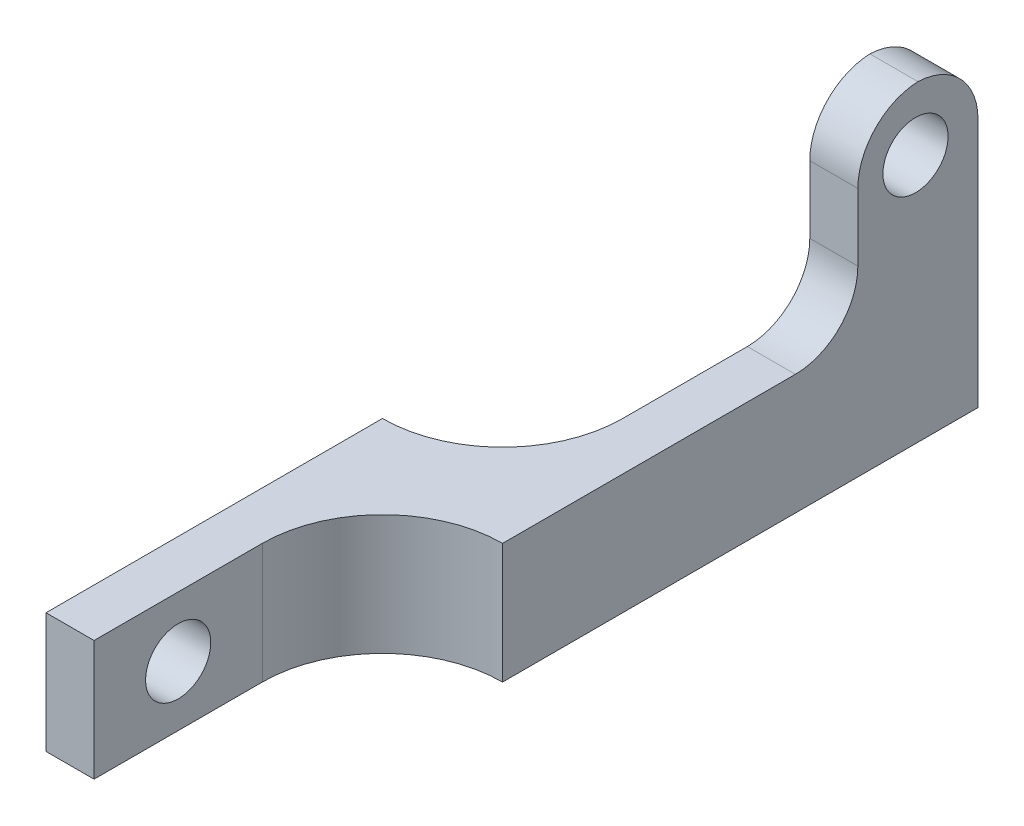
ISO-10303-21;
HEADER;
FILE_DESCRIPTION(('STEP AP214'),'2;1');
FILE_NAME('part.step','',(''),(''),'','','');
FILE_SCHEMA(('AUTOMOTIVE_DESIGN { 1 0 10303 214 1 1 1 1 }'));
ENDSEC;
DATA;
#1=APPLICATION_CONTEXT('core data for automotive mechanical design processes');
#2=APPLICATION_PROTOCOL_DEFINITION('international standard','automotive_design',2000,#1);
#3=PRODUCT_CONTEXT('',#1,'mechanical');
#4=PRODUCT('Part','Part','',(#3));
#5=PRODUCT_RELATED_PRODUCT_CATEGORY('part','',(#4));
#6=PRODUCT_DEFINITION_FORMATION('','',#4);
#7=PRODUCT_DEFINITION_CONTEXT('part definition',#1,'design');
#8=PRODUCT_DEFINITION('design','',#6,#7);
#9=PRODUCT_DEFINITION_SHAPE('','',#8);
#10=(LENGTH_UNIT() NAMED_UNIT(*) SI_UNIT(.MILLI.,.METRE.));
#11=(NAMED_UNIT(*) PLANE_ANGLE_UNIT() SI_UNIT($,.RADIAN.));
#12=(NAMED_UNIT(*) SI_UNIT($,.STERADIAN.) SOLID_ANGLE_UNIT());
#13=UNCERTAINTY_MEASURE_WITH_UNIT(LENGTH_MEASURE(1.E-05),#10,'distance_accuracy_value','');
#14=(GEOMETRIC_REPRESENTATION_CONTEXT(3) GLOBAL_UNCERTAINTY_ASSIGNED_CONTEXT((#13)) GLOBAL_UNIT_ASSIGNED_CONTEXT((#10,
#11,#12)) REPRESENTATION_CONTEXT('',''));
#15=CARTESIAN_POINT('',(0.,0.,0.));
#16=DIRECTION('',(0.,0.,1.));
#17=DIRECTION('',(1.,0.,0.));
#18=AXIS2_PLACEMENT_3D('',#15,#16,#17);
#19=CARTESIAN_POINT('',(0.,7.9375,0.));
#20=DIRECTION('',(1.,0.,0.));
#21=DIRECTION('',(0.,0.,-1.));
#22=AXIS2_PLACEMENT_3D('',#19,#20,#21);
#23=PLANE('',#22);
#24=CARTESIAN_POINT('',(0.,3.96875,-5.55625));
#25=DIRECTION('',(-1.,0.,0.));
#26=DIRECTION('',(0.,0.,1.));
#27=AXIS2_PLACEMENT_3D('',#24,#25,#26);
#28=CIRCLE('',#27,2.15264999999999);
#29=CARTESIAN_POINT('',(0.,3.96875,-3.40360000000001));
#30=VERTEX_POINT('',#29);
#31=EDGE_CURVE('E305',#30,#30,#28,.T.);
#32=ORIENTED_EDGE('',*,*,#31,.F.);
#33=EDGE_LOOP('',(#32));
#34=FACE_BOUND('',#33,.T.);
#35=DIRECTION('',(0.,0.,1.));
#36=VECTOR('',#35,1.);
#37=CARTESIAN_POINT('',(0.,0.,0.));
#38=LINE('',#37,#36);
#39=CARTESIAN_POINT('',(0.,0.,-22.225));
#40=VERTEX_POINT('',#39);
#41=CARTESIAN_POINT('',(0.,0.,0.));
#42=VERTEX_POINT('',#41);
#43=EDGE_CURVE('E192',#40,#42,#38,.T.);
#44=ORIENTED_EDGE('',*,*,#43,.T.);
#45=DIRECTION('',(0.,-1.,0.));
#46=VECTOR('',#45,1.);
#47=CARTESIAN_POINT('',(0.,7.9375,0.));
#48=LINE('',#47,#46);
#49=CARTESIAN_POINT('',(0.,7.9375,0.));
#50=VERTEX_POINT('',#49);
#51=EDGE_CURVE('E137',#50,#42,#48,.T.);
#52=ORIENTED_EDGE('',*,*,#51,.F.);
#53=DIRECTION('',(0.,0.,1.));
#54=VECTOR('',#53,1.);
#55=CARTESIAN_POINT('',(0.,7.9375,0.));
#56=LINE('',#55,#54);
#57=CARTESIAN_POINT('',(0.,7.9375,-22.225));
#58=VERTEX_POINT('',#57);
#59=EDGE_CURVE('E123',#58,#50,#56,.T.);
#60=ORIENTED_EDGE('',*,*,#59,.F.);
#61=DIRECTION('',(0.,-1.,0.));
#62=VECTOR('',#61,1.);
#63=CARTESIAN_POINT('',(0.,7.9375,-22.225));
#64=LINE('',#63,#62);
#65=EDGE_CURVE('E135',#58,#40,#64,.T.);
#66=ORIENTED_EDGE('',*,*,#65,.T.);
#67=EDGE_LOOP('',(#44,#52,#60,#66));
#68=FACE_BOUND('',#67,.T.);
#69=ADVANCED_FACE('F33',(#34,#68),#23,.F.);
#70=CARTESIAN_POINT('',(3.175,7.9375,0.));
#71=DIRECTION('',(0.,0.,-1.));
#72=DIRECTION('',(-1.,0.,0.));
#73=AXIS2_PLACEMENT_3D('',#70,#71,#72);
#74=PLANE('',#73);
#75=DIRECTION('',(1.,0.,0.));
#76=VECTOR('',#75,1.);
#77=CARTESIAN_POINT('',(3.175,0.,0.));
#78=LINE('',#77,#76);
#79=CARTESIAN_POINT('',(3.175,0.,0.));
#80=VERTEX_POINT('',#79);
#81=EDGE_CURVE('E207',#42,#80,#78,.T.);
#82=ORIENTED_EDGE('',*,*,#81,.T.);
#83=DIRECTION('',(0.,-1.,0.));
#84=VECTOR('',#83,1.);
#85=CARTESIAN_POINT('',(3.175,7.9375,0.));
#86=LINE('',#85,#84);
#87=CARTESIAN_POINT('',(3.175,7.9375,0.));
#88=VERTEX_POINT('',#87);
#89=EDGE_CURVE('E148',#88,#80,#86,.T.);
#90=ORIENTED_EDGE('',*,*,#89,.F.);
#91=DIRECTION('',(1.,0.,0.));
#92=VECTOR('',#91,1.);
#93=CARTESIAN_POINT('',(3.175,7.9375,0.));
#94=LINE('',#93,#92);
#95=EDGE_CURVE('E139',#50,#88,#94,.T.);
#96=ORIENTED_EDGE('',*,*,#95,.F.);
#97=ORIENTED_EDGE('',*,*,#51,.T.);
#98=EDGE_LOOP('',(#82,#90,#96,#97));
#99=FACE_BOUND('',#98,.T.);
#100=ADVANCED_FACE('F247',(#99),#74,.F.);
#101=CARTESIAN_POINT('',(3.175,7.9375,-19.05));
#102=DIRECTION('',(-1.,0.,0.));
#103=DIRECTION('',(0.,0.,1.));
#104=AXIS2_PLACEMENT_3D('',#101,#102,#103);
#105=PLANE('',#104);
#106=CARTESIAN_POINT('',(3.175,3.96875,-5.55625));
#107=DIRECTION('',(-1.,0.,0.));
#108=DIRECTION('',(0.,0.,1.));
#109=AXIS2_PLACEMENT_3D('',#106,#107,#108);
#110=CIRCLE('',#109,2.15264999999999);
#111=CARTESIAN_POINT('',(3.175,3.96875,-3.40360000000001));
#112=VERTEX_POINT('',#111);
#113=EDGE_CURVE('E308',#112,#112,#110,.T.);
#114=ORIENTED_EDGE('',*,*,#113,.T.);
#115=EDGE_LOOP('',(#114));
#116=FACE_BOUND('',#115,.T.);
#117=DIRECTION('',(0.,0.,-1.));
#118=VECTOR('',#117,1.);
#119=CARTESIAN_POINT('',(3.175,0.,-19.05));
#120=LINE('',#119,#118);
#121=CARTESIAN_POINT('',(3.175,0.,-11.1125));
#122=VERTEX_POINT('',#121);
#123=EDGE_CURVE('E209',#80,#122,#120,.T.);
#124=ORIENTED_EDGE('',*,*,#123,.T.);
#125=DIRECTION('',(0.,-1.,0.));
#126=VECTOR('',#125,1.);
#127=CARTESIAN_POINT('',(3.175,7.9375,-11.1125));
#128=LINE('',#127,#126);
#129=CARTESIAN_POINT('',(3.175,7.9375,-11.1125));
#130=VERTEX_POINT('',#129);
#131=EDGE_CURVE('E146',#122,#130,#128,.F.);
#132=ORIENTED_EDGE('',*,*,#131,.T.);
#133=DIRECTION('',(0.,0.,-1.));
#134=VECTOR('',#133,1.);
#135=CARTESIAN_POINT('',(3.175,7.9375,-19.05));
#136=LINE('',#135,#134);
#137=EDGE_CURVE('E199',#88,#130,#136,.T.);
#138=ORIENTED_EDGE('',*,*,#137,.F.);
#139=ORIENTED_EDGE('',*,*,#89,.T.);
#140=EDGE_LOOP('',(#124,#132,#138,#139));
#141=FACE_BOUND('',#140,.T.);
#142=ADVANCED_FACE('F230',(#116,#141),#105,.F.);
#143=CARTESIAN_POINT('',(11.1125,7.9375,-50.45837));
#144=DIRECTION('',(-1.,0.,0.));
#145=DIRECTION('',(0.,0.,1.));
#146=AXIS2_PLACEMENT_3D('',#143,#144,#145);
#147=PLANE('',#146);
#148=CARTESIAN_POINT('',(11.1125,16.51,-46.33087));
#149=DIRECTION('',(-1.,0.,0.));
#150=DIRECTION('',(0.,0.,1.));
#151=AXIS2_PLACEMENT_3D('',#148,#149,#150);
#152=CIRCLE('',#151,2.15265);
#153=CARTESIAN_POINT('',(11.1125,16.51,-44.17822));
#154=VERTEX_POINT('',#153);
#155=EDGE_CURVE('E195',#154,#154,#152,.T.);
#156=ORIENTED_EDGE('',*,*,#155,.T.);
#157=EDGE_LOOP('',(#156));
#158=FACE_BOUND('',#157,.T.);
#159=DIRECTION('',(0.,-1.,0.));
#160=VECTOR('',#159,1.);
#161=CARTESIAN_POINT('',(11.1125,7.9375,-50.45837));
#162=LINE('',#161,#160);
#163=CARTESIAN_POINT('',(11.1125,16.51,-50.45837));
#164=VERTEX_POINT('',#163);
#165=CARTESIAN_POINT('',(11.1125,0.,-50.45837));
#166=VERTEX_POINT('',#165);
#167=EDGE_CURVE('E221',#164,#166,#162,.T.);
#168=ORIENTED_EDGE('',*,*,#167,.F.);
#169=CARTESIAN_POINT('',(11.1125,16.51,-46.33087));
#170=DIRECTION('',(-1.,0.,0.));
#171=DIRECTION('',(0.,0.,1.));
#172=AXIS2_PLACEMENT_3D('',#169,#170,#171);
#173=CIRCLE('',#172,4.1275);
#174=CARTESIAN_POINT('',(11.1125,20.6344459855234,-46.48962));
#175=VERTEX_POINT('',#174);
#176=EDGE_CURVE('E166',#164,#175,#173,.F.);
#177=ORIENTED_EDGE('',*,*,#176,.T.);
#178=CARTESIAN_POINT('',(11.1125,16.51,-46.64837));
#179=DIRECTION('',(-1.,0.,0.));
#180=DIRECTION('',(0.,0.,1.));
#181=AXIS2_PLACEMENT_3D('',#178,#179,#180);
#182=CIRCLE('',#181,4.1275);
#183=CARTESIAN_POINT('',(11.1125,16.51,-42.52087));
#184=VERTEX_POINT('',#183);
#185=EDGE_CURVE('E164',#175,#184,#182,.F.);
#186=ORIENTED_EDGE('',*,*,#185,.T.);
#187=DIRECTION('',(0.,-1.,0.));
#188=VECTOR('',#187,1.);
#189=CARTESIAN_POINT('',(11.1125,20.6375,-42.52087));
#190=LINE('',#189,#188);
#191=CARTESIAN_POINT('',(11.1125,12.065,-42.52087));
#192=VERTEX_POINT('',#191);
#193=EDGE_CURVE('E174',#184,#192,#190,.T.);
#194=ORIENTED_EDGE('',*,*,#193,.T.);
#195=CARTESIAN_POINT('',(11.1125,12.065,-38.39337));
#196=DIRECTION('',(-1.,0.,0.));
#197=DIRECTION('',(0.,0.,1.));
#198=AXIS2_PLACEMENT_3D('',#195,#196,#197);
#199=CIRCLE('',#198,4.1275);
#200=CARTESIAN_POINT('',(11.1125,7.9375,-38.39337));
#201=VERTEX_POINT('',#200);
#202=EDGE_CURVE('E42',#192,#201,#199,.T.);
#203=ORIENTED_EDGE('',*,*,#202,.T.);
#204=DIRECTION('',(0.,0.,-1.));
#205=VECTOR('',#204,1.);
#206=CARTESIAN_POINT('',(11.1125,7.9375,-50.45837));
#207=LINE('',#206,#205);
#208=CARTESIAN_POINT('',(11.1125,7.9375,-19.05));
#209=VERTEX_POINT('',#208);
#210=EDGE_CURVE('E202',#209,#201,#207,.T.);
#211=ORIENTED_EDGE('',*,*,#210,.F.);
#212=DIRECTION('',(0.,-1.,0.));
#213=VECTOR('',#212,1.);
#214=CARTESIAN_POINT('',(11.1125,7.9375,-19.05));
#215=LINE('',#214,#213);
#216=CARTESIAN_POINT('',(11.1125,0.,-19.05));
#217=VERTEX_POINT('',#216);
#218=EDGE_CURVE('E223',#209,#217,#215,.T.);
#219=ORIENTED_EDGE('',*,*,#218,.T.);
#220=DIRECTION('',(0.,0.,-1.));
#221=VECTOR('',#220,1.);
#222=CARTESIAN_POINT('',(11.1125,0.,-50.45837));
#223=LINE('',#222,#221);
#224=EDGE_CURVE('E212',#217,#166,#223,.T.);
#225=ORIENTED_EDGE('',*,*,#224,.T.);
#226=EDGE_LOOP('',(#168,#177,#186,#194,#203,#211,#219,#225));
#227=FACE_BOUND('',#226,.T.);
#228=ADVANCED_FACE('F189',(#158,#227),#147,.F.);
#229=CARTESIAN_POINT('',(7.9375,7.9375,-50.45837));
#230=DIRECTION('',(0.,0.,1.));
#231=DIRECTION('',(1.,0.,0.));
#232=AXIS2_PLACEMENT_3D('',#229,#230,#231);
#233=PLANE('',#232);
#234=DIRECTION('',(0.,-1.,0.));
#235=VECTOR('',#234,1.);
#236=CARTESIAN_POINT('',(7.9375,7.9375,-50.45837));
#237=LINE('',#236,#235);
#238=CARTESIAN_POINT('',(7.9375,16.51,-50.45837));
#239=VERTEX_POINT('',#238);
#240=CARTESIAN_POINT('',(7.9375,0.,-50.45837));
#241=VERTEX_POINT('',#240);
#242=EDGE_CURVE('E205',#239,#241,#237,.T.);
#243=ORIENTED_EDGE('',*,*,#242,.F.);
#244=DIRECTION('',(-1.,0.,0.));
#245=VECTOR('',#244,1.);
#246=CARTESIAN_POINT('',(7.9375,16.51,-50.45837));
#247=LINE('',#246,#245);
#248=EDGE_CURVE('E161',#239,#164,#247,.F.);
#249=ORIENTED_EDGE('',*,*,#248,.T.);
#250=ORIENTED_EDGE('',*,*,#167,.T.);
#251=DIRECTION('',(-1.,0.,0.));
#252=VECTOR('',#251,1.);
#253=CARTESIAN_POINT('',(7.9375,0.,-50.45837));
#254=LINE('',#253,#252);
#255=EDGE_CURVE('E215',#166,#241,#254,.T.);
#256=ORIENTED_EDGE('',*,*,#255,.T.);
#257=EDGE_LOOP('',(#243,#249,#250,#256));
#258=FACE_BOUND('',#257,.T.);
#259=ADVANCED_FACE('F278',(#258),#233,.F.);
#260=CARTESIAN_POINT('',(7.9375,7.9375,-22.225));
#261=DIRECTION('',(1.,0.,0.));
#262=DIRECTION('',(0.,0.,-1.));
#263=AXIS2_PLACEMENT_3D('',#260,#261,#262);
#264=PLANE('',#263);
#265=CARTESIAN_POINT('',(7.9375,16.51,-46.33087));
#266=DIRECTION('',(1.,0.,0.));
#267=DIRECTION('',(0.,0.,-1.));
#268=AXIS2_PLACEMENT_3D('',#265,#266,#267);
#269=CIRCLE('',#268,2.15264999999999);
#270=CARTESIAN_POINT('',(7.9375,16.51,-48.48352));
#271=VERTEX_POINT('',#270);
#272=EDGE_CURVE('E37',#271,#271,#269,.T.);
#273=ORIENTED_EDGE('',*,*,#272,.T.);
#274=EDGE_LOOP('',(#273));
#275=FACE_BOUND('',#274,.T.);
#276=CARTESIAN_POINT('',(7.9375,16.51,-46.64837));
#277=DIRECTION('',(1.,0.,0.));
#278=DIRECTION('',(0.,0.,-1.));
#279=AXIS2_PLACEMENT_3D('',#276,#277,#278);
#280=CIRCLE('',#279,4.1275);
#281=CARTESIAN_POINT('',(7.9375,16.51,-42.52087));
#282=VERTEX_POINT('',#281);
#283=CARTESIAN_POINT('',(7.9375,20.6344459855234,-46.48962));
#284=VERTEX_POINT('',#283);
#285=EDGE_CURVE('E157',#282,#284,#280,.F.);
#286=ORIENTED_EDGE('',*,*,#285,.T.);
#287=CARTESIAN_POINT('',(7.9375,16.51,-46.33087));
#288=DIRECTION('',(1.,0.,0.));
#289=DIRECTION('',(0.,0.,-1.));
#290=AXIS2_PLACEMENT_3D('',#287,#288,#289);
#291=CIRCLE('',#290,4.1275);
#292=EDGE_CURVE('E159',#284,#239,#291,.F.);
#293=ORIENTED_EDGE('',*,*,#292,.T.);
#294=ORIENTED_EDGE('',*,*,#242,.T.);
#295=DIRECTION('',(0.,0.,1.));
#296=VECTOR('',#295,1.);
#297=CARTESIAN_POINT('',(7.9375,0.,-22.225));
#298=LINE('',#297,#296);
#299=CARTESIAN_POINT('',(7.9375,0.,-30.1625));
#300=VERTEX_POINT('',#299);
#301=EDGE_CURVE('E140',#241,#300,#298,.T.);
#302=ORIENTED_EDGE('',*,*,#301,.T.);
#303=DIRECTION('',(0.,-1.,0.));
#304=VECTOR('',#303,1.);
#305=CARTESIAN_POINT('',(7.9375,7.9375,-30.1625));
#306=LINE('',#305,#304);
#307=CARTESIAN_POINT('',(7.9375,7.9375,-30.1625));
#308=VERTEX_POINT('',#307);
#309=EDGE_CURVE('E144',#300,#308,#306,.F.);
#310=ORIENTED_EDGE('',*,*,#309,.T.);
#311=DIRECTION('',(0.,0.,1.));
#312=VECTOR('',#311,1.);
#313=CARTESIAN_POINT('',(7.9375,7.9375,-22.225));
#314=LINE('',#313,#312);
#315=CARTESIAN_POINT('',(7.9375,7.9375,-38.39337));
#316=VERTEX_POINT('',#315);
#317=EDGE_CURVE('E125',#316,#308,#314,.T.);
#318=ORIENTED_EDGE('',*,*,#317,.F.);
#319=CARTESIAN_POINT('',(7.9375,12.065,-38.39337));
#320=DIRECTION('',(1.,0.,0.));
#321=DIRECTION('',(0.,0.,-1.));
#322=AXIS2_PLACEMENT_3D('',#319,#320,#321);
#323=CIRCLE('',#322,4.1275);
#324=CARTESIAN_POINT('',(7.9375,12.065,-42.52087));
#325=VERTEX_POINT('',#324);
#326=EDGE_CURVE('E11',#316,#325,#323,.T.);
#327=ORIENTED_EDGE('',*,*,#326,.T.);
#328=DIRECTION('',(0.,-1.,0.));
#329=VECTOR('',#328,1.);
#330=CARTESIAN_POINT('',(7.9375,20.6375,-42.52087));
#331=LINE('',#330,#329);
#332=EDGE_CURVE('E185',#282,#325,#331,.T.);
#333=ORIENTED_EDGE('',*,*,#332,.F.);
#334=EDGE_LOOP('',(#286,#293,#294,#302,#310,#318,#327,#333));
#335=FACE_BOUND('',#334,.T.);
#336=ADVANCED_FACE('F243',(#275,#335),#264,.F.);
#337=CARTESIAN_POINT('',(0.,7.9375,0.));
#338=DIRECTION('',(0.,1.,0.));
#339=DIRECTION('',(0.,0.,1.));
#340=AXIS2_PLACEMENT_3D('',#337,#338,#339);
#341=PLANE('',#340);
#342=ORIENTED_EDGE('',*,*,#210,.T.);
#343=DIRECTION('',(1.,0.,0.));
#344=VECTOR('',#343,1.);
#345=CARTESIAN_POINT('',(0.,7.9375,-38.39337));
#346=LINE('',#345,#344);
#347=EDGE_CURVE('E55',#201,#316,#346,.F.);
#348=ORIENTED_EDGE('',*,*,#347,.T.);
#349=ORIENTED_EDGE('',*,*,#317,.T.);
#350=CARTESIAN_POINT('',(0.,7.9375,-30.1625));
#351=DIRECTION('',(0.,1.,0.));
#352=DIRECTION('',(0.,0.,1.));
#353=AXIS2_PLACEMENT_3D('',#350,#351,#352);
#354=CIRCLE('',#353,7.9375);
#355=EDGE_CURVE('E120',#308,#58,#354,.F.);
#356=ORIENTED_EDGE('',*,*,#355,.T.);
#357=ORIENTED_EDGE('',*,*,#59,.T.);
#358=ORIENTED_EDGE('',*,*,#95,.T.);
#359=ORIENTED_EDGE('',*,*,#137,.T.);
#360=CARTESIAN_POINT('',(11.1125,7.9375,-11.1125));
#361=DIRECTION('',(0.,1.,0.));
#362=DIRECTION('',(0.,0.,1.));
#363=AXIS2_PLACEMENT_3D('',#360,#361,#362);
#364=CIRCLE('',#363,7.9375);
#365=EDGE_CURVE('E155',#130,#209,#364,.F.);
#366=ORIENTED_EDGE('',*,*,#365,.T.);
#367=EDGE_LOOP('',(#342,#348,#349,#356,#357,#358,#359,#366));
#368=FACE_BOUND('',#367,.T.);
#369=ADVANCED_FACE('F122',(#368),#341,.T.);
#370=CARTESIAN_POINT('',(0.,0.,0.));
#371=DIRECTION('',(0.,1.,0.));
#372=DIRECTION('',(0.,0.,1.));
#373=AXIS2_PLACEMENT_3D('',#370,#371,#372);
#374=PLANE('',#373);
#375=ORIENTED_EDGE('',*,*,#43,.F.);
#376=CARTESIAN_POINT('',(0.,0.,-30.1625));
#377=DIRECTION('',(0.,1.,0.));
#378=DIRECTION('',(0.,0.,1.));
#379=AXIS2_PLACEMENT_3D('',#376,#377,#378);
#380=CIRCLE('',#379,7.9375);
#381=EDGE_CURVE('E131',#40,#300,#380,.T.);
#382=ORIENTED_EDGE('',*,*,#381,.T.);
#383=ORIENTED_EDGE('',*,*,#301,.F.);
#384=ORIENTED_EDGE('',*,*,#255,.F.);
#385=ORIENTED_EDGE('',*,*,#224,.F.);
#386=CARTESIAN_POINT('',(11.1125,0.,-11.1125));
#387=DIRECTION('',(0.,1.,0.));
#388=DIRECTION('',(0.,0.,1.));
#389=AXIS2_PLACEMENT_3D('',#386,#387,#388);
#390=CIRCLE('',#389,7.9375);
#391=EDGE_CURVE('E130',#217,#122,#390,.T.);
#392=ORIENTED_EDGE('',*,*,#391,.T.);
#393=ORIENTED_EDGE('',*,*,#123,.F.);
#394=ORIENTED_EDGE('',*,*,#81,.F.);
#395=EDGE_LOOP('',(#375,#382,#383,#384,#385,#392,#393,#394));
#396=FACE_BOUND('',#395,.T.);
#397=ADVANCED_FACE('F235',(#396),#374,.F.);
#398=CARTESIAN_POINT('',(0.,7.9375,-30.1625));
#399=DIRECTION('',(0.,1.,0.));
#400=DIRECTION('',(0.,0.,1.));
#401=AXIS2_PLACEMENT_3D('',#398,#399,#400);
#402=CYLINDRICAL_SURFACE('',#401,7.9375);
#403=ORIENTED_EDGE('',*,*,#355,.F.);
#404=ORIENTED_EDGE('',*,*,#309,.F.);
#405=ORIENTED_EDGE('',*,*,#381,.F.);
#406=ORIENTED_EDGE('',*,*,#65,.F.);
#407=EDGE_LOOP('',(#403,#404,#405,#406));
#408=FACE_BOUND('',#407,.T.);
#409=ADVANCED_FACE('F142',(#408),#402,.F.);
#410=CARTESIAN_POINT('',(11.1125,7.9375,-11.1125));
#411=DIRECTION('',(0.,1.,0.));
#412=DIRECTION('',(0.,0.,1.));
#413=AXIS2_PLACEMENT_3D('',#410,#411,#412);
#414=CYLINDRICAL_SURFACE('',#413,7.9375);
#415=ORIENTED_EDGE('',*,*,#365,.F.);
#416=ORIENTED_EDGE('',*,*,#131,.F.);
#417=ORIENTED_EDGE('',*,*,#391,.F.);
#418=ORIENTED_EDGE('',*,*,#218,.F.);
#419=EDGE_LOOP('',(#415,#416,#417,#418));
#420=FACE_BOUND('',#419,.T.);
#421=ADVANCED_FACE('F241',(#420),#414,.F.);
#422=CARTESIAN_POINT('',(11.1125,20.6375,-42.52087));
#423=DIRECTION('',(0.,0.,-1.));
#424=DIRECTION('',(-1.,0.,0.));
#425=AXIS2_PLACEMENT_3D('',#422,#423,#424);
#426=PLANE('',#425);
#427=ORIENTED_EDGE('',*,*,#332,.T.);
#428=DIRECTION('',(1.,0.,0.));
#429=VECTOR('',#428,1.);
#430=CARTESIAN_POINT('',(11.1125,12.065,-42.52087));
#431=LINE('',#430,#429);
#432=EDGE_CURVE('E170',#325,#192,#431,.T.);
#433=ORIENTED_EDGE('',*,*,#432,.T.);
#434=ORIENTED_EDGE('',*,*,#193,.F.);
#435=DIRECTION('',(1.,0.,0.));
#436=VECTOR('',#435,1.);
#437=CARTESIAN_POINT('',(11.1125,16.51,-42.52087));
#438=LINE('',#437,#436);
#439=EDGE_CURVE('E168',#184,#282,#438,.F.);
#440=ORIENTED_EDGE('',*,*,#439,.T.);
#441=EDGE_LOOP('',(#427,#433,#434,#440));
#442=FACE_BOUND('',#441,.T.);
#443=ADVANCED_FACE('F182',(#442),#426,.F.);
#444=CARTESIAN_POINT('',(0.,16.51,-46.64837));
#445=DIRECTION('',(1.,0.,0.));
#446=DIRECTION('',(0.,0.,-1.));
#447=AXIS2_PLACEMENT_3D('',#444,#445,#446);
#448=CYLINDRICAL_SURFACE('',#447,4.1275);
#449=ORIENTED_EDGE('',*,*,#439,.F.);
#450=ORIENTED_EDGE('',*,*,#185,.F.);
#451=DIRECTION('',(1.,0.,0.));
#452=VECTOR('',#451,1.);
#453=CARTESIAN_POINT('',(9.525,20.6344459855234,-46.48962));
#454=LINE('',#453,#452);
#455=EDGE_CURVE('E171',#284,#175,#454,.T.);
#456=ORIENTED_EDGE('',*,*,#455,.F.);
#457=ORIENTED_EDGE('',*,*,#285,.F.);
#458=EDGE_LOOP('',(#449,#450,#456,#457));
#459=FACE_BOUND('',#458,.T.);
#460=ADVANCED_FACE('F266',(#459),#448,.T.);
#461=CARTESIAN_POINT('',(0.,16.51,-46.33087));
#462=DIRECTION('',(-1.,0.,0.));
#463=DIRECTION('',(0.,0.,1.));
#464=AXIS2_PLACEMENT_3D('',#461,#462,#463);
#465=CYLINDRICAL_SURFACE('',#464,4.1275);
#466=ORIENTED_EDGE('',*,*,#176,.F.);
#467=ORIENTED_EDGE('',*,*,#248,.F.);
#468=ORIENTED_EDGE('',*,*,#292,.F.);
#469=ORIENTED_EDGE('',*,*,#455,.T.);
#470=EDGE_LOOP('',(#466,#467,#468,#469));
#471=FACE_BOUND('',#470,.T.);
#472=ADVANCED_FACE('F264',(#471),#465,.T.);
#473=CARTESIAN_POINT('',(11.1125,12.065,-38.39337));
#474=DIRECTION('',(1.,0.,0.));
#475=DIRECTION('',(0.,0.,-1.));
#476=AXIS2_PLACEMENT_3D('',#473,#474,#475);
#477=CYLINDRICAL_SURFACE('',#476,4.1275);
#478=ORIENTED_EDGE('',*,*,#326,.F.);
#479=ORIENTED_EDGE('',*,*,#347,.F.);
#480=ORIENTED_EDGE('',*,*,#202,.F.);
#481=ORIENTED_EDGE('',*,*,#432,.F.);
#482=EDGE_LOOP('',(#478,#479,#480,#481));
#483=FACE_BOUND('',#482,.T.);
#484=ADVANCED_FACE('F35',(#483),#477,.F.);
#485=CARTESIAN_POINT('',(0.,16.51,-46.33087));
#486=DIRECTION('',(-1.,0.,0.));
#487=DIRECTION('',(0.,0.,1.));
#488=AXIS2_PLACEMENT_3D('',#485,#486,#487);
#489=CYLINDRICAL_SURFACE('',#488,2.15264999999999);
#490=ORIENTED_EDGE('',*,*,#155,.F.);
#491=EDGE_LOOP('',(#490));
#492=FACE_BOUND('',#491,.T.);
#493=ORIENTED_EDGE('',*,*,#272,.F.);
#494=EDGE_LOOP('',(#493));
#495=FACE_BOUND('',#494,.T.);
#496=ADVANCED_FACE('F293',(#492,#495),#489,.F.);
#497=CARTESIAN_POINT('',(0.,3.96875,-5.55625));
#498=DIRECTION('',(-1.,0.,0.));
#499=DIRECTION('',(0.,0.,1.));
#500=AXIS2_PLACEMENT_3D('',#497,#498,#499);
#501=CYLINDRICAL_SURFACE('',#500,2.15264999999999);
#502=ORIENTED_EDGE('',*,*,#31,.T.);
#503=EDGE_LOOP('',(#502));
#504=FACE_BOUND('',#503,.T.);
#505=ORIENTED_EDGE('',*,*,#113,.F.);
#506=EDGE_LOOP('',(#505));
#507=FACE_BOUND('',#506,.T.);
#508=ADVANCED_FACE('F296',(#504,#507),#501,.F.);
#509=CLOSED_SHELL('',(#69,#100,#142,#228,#259,#336,#369,#397,#409,#421,#443,#460,#472,#484,#496,#508));
#510=MANIFOLD_SOLID_BREP('B2',#509);
#511=ADVANCED_BREP_SHAPE_REPRESENTATION('',(#18,#510),#14);
#512=SHAPE_DEFINITION_REPRESENTATION(#9,#511);
ENDSEC;
END-ISO-10303-21;
